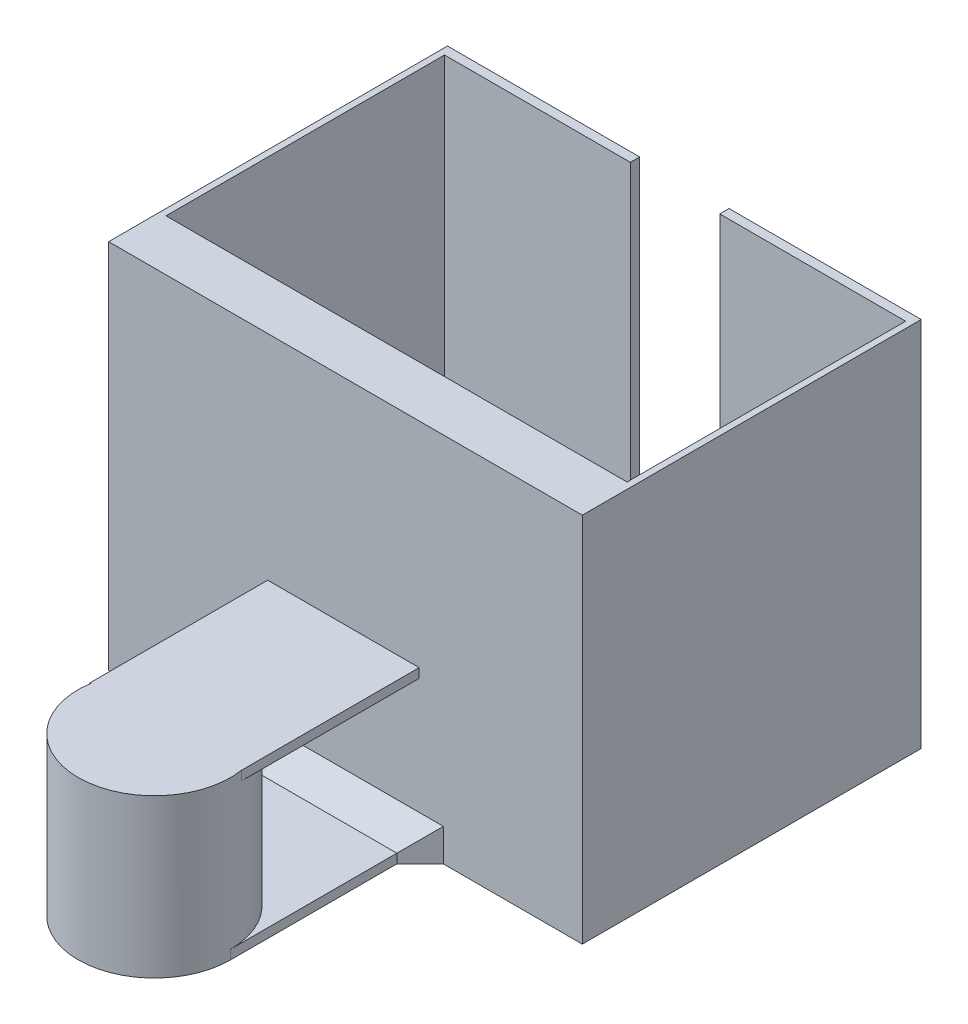
ISO-10303-21;
HEADER;
FILE_DESCRIPTION(('STEP AP214'),'2;1');
FILE_NAME('part.step','',(''),(''),'','','');
FILE_SCHEMA(('AUTOMOTIVE_DESIGN { 1 0 10303 214 1 1 1 1 }'));
ENDSEC;
DATA;
#1=APPLICATION_CONTEXT('core data for automotive mechanical design processes');
#2=APPLICATION_PROTOCOL_DEFINITION('international standard','automotive_design',2000,#1);
#3=PRODUCT_CONTEXT('',#1,'mechanical');
#4=PRODUCT('Part','Part','',(#3));
#5=PRODUCT_RELATED_PRODUCT_CATEGORY('part','',(#4));
#6=PRODUCT_DEFINITION_FORMATION('','',#4);
#7=PRODUCT_DEFINITION_CONTEXT('part definition',#1,'design');
#8=PRODUCT_DEFINITION('design','',#6,#7);
#9=PRODUCT_DEFINITION_SHAPE('','',#8);
#10=(LENGTH_UNIT() NAMED_UNIT(*) SI_UNIT(.MILLI.,.METRE.));
#11=(NAMED_UNIT(*) PLANE_ANGLE_UNIT() SI_UNIT($,.RADIAN.));
#12=(NAMED_UNIT(*) SI_UNIT($,.STERADIAN.) SOLID_ANGLE_UNIT());
#13=UNCERTAINTY_MEASURE_WITH_UNIT(LENGTH_MEASURE(1.E-05),#10,'distance_accuracy_value','');
#14=(GEOMETRIC_REPRESENTATION_CONTEXT(3) GLOBAL_UNCERTAINTY_ASSIGNED_CONTEXT((#13)) GLOBAL_UNIT_ASSIGNED_CONTEXT((#10,
#11,#12)) REPRESENTATION_CONTEXT('',''));
#15=CARTESIAN_POINT('',(0.,0.,0.));
#16=DIRECTION('',(0.,0.,1.));
#17=DIRECTION('',(1.,0.,0.));
#18=AXIS2_PLACEMENT_3D('',#15,#16,#17);
#19=CARTESIAN_POINT('',(40.4228170122298,50.8,-60.8869664013859));
#20=DIRECTION('',(0.,0.,-1.));
#21=DIRECTION('',(-1.,0.,0.));
#22=AXIS2_PLACEMENT_3D('',#19,#20,#21);
#23=PLANE('',#22);
#24=DIRECTION('',(1.,0.,0.));
#25=VECTOR('',#24,1.);
#26=CARTESIAN_POINT('',(83.0107805210788,4.44499999999998,-60.8869664013859));
#27=LINE('',#26,#25);
#28=CARTESIAN_POINT('',(59.0031335033808,4.44499999999998,-60.8869664013859));
#29=VERTEX_POINT('',#28);
#30=CARTESIAN_POINT('',(86.1857805210788,4.44499999999998,-60.8869664013859));
#31=VERTEX_POINT('',#30);
#32=EDGE_CURVE('E432',#29,#31,#27,.T.);
#33=ORIENTED_EDGE('',*,*,#32,.T.);
#34=DIRECTION('',(0.,-1.,0.));
#35=VECTOR('',#34,1.);
#36=CARTESIAN_POINT('',(86.1857805210788,0.,-60.8869664013859));
#37=LINE('',#36,#35);
#38=CARTESIAN_POINT('',(86.1857805210788,0.,-60.8869664013859));
#39=VERTEX_POINT('',#38);
#40=EDGE_CURVE('E435',#31,#39,#37,.T.);
#41=ORIENTED_EDGE('',*,*,#40,.T.);
#42=DIRECTION('',(1.,0.,0.));
#43=VECTOR('',#42,1.);
#44=CARTESIAN_POINT('',(40.4228170122298,0.,-60.8869664013859));
#45=LINE('',#44,#43);
#46=CARTESIAN_POINT('',(105.19281701223,0.,-60.8869664013859));
#47=VERTEX_POINT('',#46);
#48=EDGE_CURVE('E342',#39,#47,#45,.T.);
#49=ORIENTED_EDGE('',*,*,#48,.T.);
#50=DIRECTION('',(0.,-1.,0.));
#51=VECTOR('',#50,1.);
#52=CARTESIAN_POINT('',(105.19281701223,50.8,-60.8869664013859));
#53=LINE('',#52,#51);
#54=CARTESIAN_POINT('',(105.19281701223,50.8,-60.8869664013859));
#55=VERTEX_POINT('',#54);
#56=EDGE_CURVE('E415',#55,#47,#53,.T.);
#57=ORIENTED_EDGE('',*,*,#56,.F.);
#58=DIRECTION('',(1.,0.,0.));
#59=VECTOR('',#58,1.);
#60=CARTESIAN_POINT('',(40.4228170122298,50.8,-60.8869664013859));
#61=LINE('',#60,#59);
#62=CARTESIAN_POINT('',(40.4228170122298,50.8,-60.8869664013859));
#63=VERTEX_POINT('',#62);
#64=EDGE_CURVE('E304',#63,#55,#61,.T.);
#65=ORIENTED_EDGE('',*,*,#64,.F.);
#66=DIRECTION('',(0.,-1.,0.));
#67=VECTOR('',#66,1.);
#68=CARTESIAN_POINT('',(40.4228170122298,50.8,-60.8869664013859));
#69=LINE('',#68,#67);
#70=CARTESIAN_POINT('',(40.4228170122298,0.,-60.8869664013859));
#71=VERTEX_POINT('',#70);
#72=EDGE_CURVE('E419',#63,#71,#69,.T.);
#73=ORIENTED_EDGE('',*,*,#72,.T.);
#74=CARTESIAN_POINT('',(59.0031335033808,0.,-60.8869664013859));
#75=VERTEX_POINT('',#74);
#76=EDGE_CURVE('E343',#71,#75,#45,.T.);
#77=ORIENTED_EDGE('',*,*,#76,.T.);
#78=DIRECTION('',(0.,1.,0.));
#79=VECTOR('',#78,1.);
#80=CARTESIAN_POINT('',(59.0031335033808,1.27,-60.8869664013859));
#81=LINE('',#80,#79);
#82=EDGE_CURVE('E429',#75,#29,#81,.T.);
#83=ORIENTED_EDGE('',*,*,#82,.T.);
#84=EDGE_LOOP('',(#33,#41,#49,#57,#65,#73,#77,#83));
#85=FACE_BOUND('',#84,.T.);
#86=DIRECTION('',(-1.,0.,0.));
#87=VECTOR('',#86,1.);
#88=CARTESIAN_POINT('',(62.1781335033808,20.32,-60.8869664013859));
#89=LINE('',#88,#87);
#90=CARTESIAN_POINT('',(82.8854084274792,20.32,-60.8869664013859));
#91=VERTEX_POINT('',#90);
#92=CARTESIAN_POINT('',(62.1781335033808,20.32,-60.8869664013859));
#93=VERTEX_POINT('',#92);
#94=EDGE_CURVE('E220',#91,#93,#89,.T.);
#95=ORIENTED_EDGE('',*,*,#94,.T.);
#96=DIRECTION('',(0.,1.,0.));
#97=VECTOR('',#96,1.);
#98=CARTESIAN_POINT('',(62.1781335033808,20.32,-60.8869664013859));
#99=LINE('',#98,#97);
#100=CARTESIAN_POINT('',(62.1781335033808,21.59,-60.8869664013859));
#101=VERTEX_POINT('',#100);
#102=EDGE_CURVE('E236',#93,#101,#99,.T.);
#103=ORIENTED_EDGE('',*,*,#102,.T.);
#104=DIRECTION('',(-1.,0.,0.));
#105=VECTOR('',#104,1.);
#106=CARTESIAN_POINT('',(62.1781335033808,21.59,-60.8869664013859));
#107=LINE('',#106,#105);
#108=CARTESIAN_POINT('',(82.8854084274792,21.59,-60.8869664013859));
#109=VERTEX_POINT('',#108);
#110=EDGE_CURVE('E238',#109,#101,#107,.T.);
#111=ORIENTED_EDGE('',*,*,#110,.F.);
#112=DIRECTION('',(0.,1.,0.));
#113=VECTOR('',#112,1.);
#114=CARTESIAN_POINT('',(82.8854084274792,20.32,-60.8869664013859));
#115=LINE('',#114,#113);
#116=EDGE_CURVE('E259',#91,#109,#115,.T.);
#117=ORIENTED_EDGE('',*,*,#116,.F.);
#118=EDGE_LOOP('',(#95,#103,#111,#117));
#119=FACE_BOUND('',#118,.T.);
#120=ADVANCED_FACE('F49',(#85,#119),#23,.F.);
#121=CARTESIAN_POINT('',(40.4228170122298,50.8,-60.8869664013859));
#122=DIRECTION('',(1.,0.,0.));
#123=DIRECTION('',(0.,0.,-1.));
#124=AXIS2_PLACEMENT_3D('',#121,#122,#123);
#125=PLANE('',#124);
#126=DIRECTION('',(0.,0.,1.));
#127=VECTOR('',#126,1.);
#128=CARTESIAN_POINT('',(40.4228170122298,0.,-60.8869664013859));
#129=LINE('',#128,#127);
#130=CARTESIAN_POINT('',(40.4228170122298,0.,-107.222916401386));
#131=VERTEX_POINT('',#130);
#132=EDGE_CURVE('E299',#131,#71,#129,.T.);
#133=ORIENTED_EDGE('',*,*,#132,.T.);
#134=ORIENTED_EDGE('',*,*,#72,.F.);
#135=DIRECTION('',(0.,0.,1.));
#136=VECTOR('',#135,1.);
#137=CARTESIAN_POINT('',(40.4228170122298,50.8,-60.8869664013859));
#138=LINE('',#137,#136);
#139=CARTESIAN_POINT('',(40.4228170122298,50.8,-107.222916401386));
#140=VERTEX_POINT('',#139);
#141=EDGE_CURVE('E300',#140,#63,#138,.T.);
#142=ORIENTED_EDGE('',*,*,#141,.F.);
#143=DIRECTION('',(0.,-1.,0.));
#144=VECTOR('',#143,1.);
#145=CARTESIAN_POINT('',(40.4228170122298,50.8,-107.222916401386));
#146=LINE('',#145,#144);
#147=EDGE_CURVE('E338',#140,#131,#146,.T.);
#148=ORIENTED_EDGE('',*,*,#147,.T.);
#149=EDGE_LOOP('',(#133,#134,#142,#148));
#150=FACE_BOUND('',#149,.T.);
#151=ADVANCED_FACE('F468',(#150),#125,.F.);
#152=CARTESIAN_POINT('',(105.19281701223,50.8,-60.8869664013859));
#153=DIRECTION('',(-1.,0.,0.));
#154=DIRECTION('',(0.,0.,1.));
#155=AXIS2_PLACEMENT_3D('',#152,#153,#154);
#156=PLANE('',#155);
#157=DIRECTION('',(0.,0.,-1.));
#158=VECTOR('',#157,1.);
#159=CARTESIAN_POINT('',(105.19281701223,0.,-60.8869664013859));
#160=LINE('',#159,#158);
#161=CARTESIAN_POINT('',(105.19281701223,0.,-107.222916401386));
#162=VERTEX_POINT('',#161);
#163=EDGE_CURVE('E347',#47,#162,#160,.T.);
#164=ORIENTED_EDGE('',*,*,#163,.T.);
#165=DIRECTION('',(0.,-1.,0.));
#166=VECTOR('',#165,1.);
#167=CARTESIAN_POINT('',(105.19281701223,50.8,-107.222916401386));
#168=LINE('',#167,#166);
#169=CARTESIAN_POINT('',(105.19281701223,50.8,-107.222916401386));
#170=VERTEX_POINT('',#169);
#171=EDGE_CURVE('E411',#170,#162,#168,.T.);
#172=ORIENTED_EDGE('',*,*,#171,.F.);
#173=DIRECTION('',(0.,0.,-1.));
#174=VECTOR('',#173,1.);
#175=CARTESIAN_POINT('',(105.19281701223,50.8,-60.8869664013859));
#176=LINE('',#175,#174);
#177=EDGE_CURVE('E308',#55,#170,#176,.T.);
#178=ORIENTED_EDGE('',*,*,#177,.F.);
#179=ORIENTED_EDGE('',*,*,#56,.T.);
#180=EDGE_LOOP('',(#164,#172,#178,#179));
#181=FACE_BOUND('',#180,.T.);
#182=ADVANCED_FACE('F519',(#181),#156,.F.);
#183=CARTESIAN_POINT('',(78.9190570122298,50.8,-107.222916401386));
#184=DIRECTION('',(0.,0.,1.));
#185=DIRECTION('',(1.,0.,0.));
#186=AXIS2_PLACEMENT_3D('',#183,#184,#185);
#187=PLANE('',#186);
#188=DIRECTION('',(-1.,0.,0.));
#189=VECTOR('',#188,1.);
#190=CARTESIAN_POINT('',(78.9190570122298,0.,-107.222916401386));
#191=LINE('',#190,#189);
#192=CARTESIAN_POINT('',(78.9190570122298,0.,-107.222916401386));
#193=VERTEX_POINT('',#192);
#194=EDGE_CURVE('E350',#162,#193,#191,.T.);
#195=ORIENTED_EDGE('',*,*,#194,.T.);
#196=DIRECTION('',(0.,-1.,0.));
#197=VECTOR('',#196,1.);
#198=CARTESIAN_POINT('',(78.9190570122298,50.8,-107.222916401386));
#199=LINE('',#198,#197);
#200=CARTESIAN_POINT('',(78.9190570122298,50.8,-107.222916401386));
#201=VERTEX_POINT('',#200);
#202=EDGE_CURVE('E407',#201,#193,#199,.T.);
#203=ORIENTED_EDGE('',*,*,#202,.F.);
#204=DIRECTION('',(-1.,0.,0.));
#205=VECTOR('',#204,1.);
#206=CARTESIAN_POINT('',(78.9190570122298,50.8,-107.222916401386));
#207=LINE('',#206,#205);
#208=EDGE_CURVE('E311',#170,#201,#207,.T.);
#209=ORIENTED_EDGE('',*,*,#208,.F.);
#210=ORIENTED_EDGE('',*,*,#171,.T.);
#211=EDGE_LOOP('',(#195,#203,#209,#210));
#212=FACE_BOUND('',#211,.T.);
#213=ADVANCED_FACE('F513',(#212),#187,.F.);
#214=CARTESIAN_POINT('',(78.9190570122298,50.8,-105.952916401386));
#215=DIRECTION('',(1.,0.,0.));
#216=DIRECTION('',(0.,0.,-1.));
#217=AXIS2_PLACEMENT_3D('',#214,#215,#216);
#218=PLANE('',#217);
#219=DIRECTION('',(0.,0.,1.));
#220=VECTOR('',#219,1.);
#221=CARTESIAN_POINT('',(78.9190570122298,0.,-105.952916401386));
#222=LINE('',#221,#220);
#223=CARTESIAN_POINT('',(78.9190570122298,0.,-105.952916401386));
#224=VERTEX_POINT('',#223);
#225=EDGE_CURVE('E353',#193,#224,#222,.T.);
#226=ORIENTED_EDGE('',*,*,#225,.T.);
#227=DIRECTION('',(0.,-1.,0.));
#228=VECTOR('',#227,1.);
#229=CARTESIAN_POINT('',(78.9190570122298,50.8,-105.952916401386));
#230=LINE('',#229,#228);
#231=CARTESIAN_POINT('',(78.9190570122298,50.8,-105.952916401386));
#232=VERTEX_POINT('',#231);
#233=EDGE_CURVE('E403',#232,#224,#230,.T.);
#234=ORIENTED_EDGE('',*,*,#233,.F.);
#235=DIRECTION('',(0.,0.,1.));
#236=VECTOR('',#235,1.);
#237=CARTESIAN_POINT('',(78.9190570122298,50.8,-105.952916401386));
#238=LINE('',#237,#236);
#239=EDGE_CURVE('E314',#201,#232,#238,.T.);
#240=ORIENTED_EDGE('',*,*,#239,.F.);
#241=ORIENTED_EDGE('',*,*,#202,.T.);
#242=EDGE_LOOP('',(#226,#234,#240,#241));
#243=FACE_BOUND('',#242,.T.);
#244=ADVANCED_FACE('F509',(#243),#218,.F.);
#245=CARTESIAN_POINT('',(104.32921701223,50.8,-105.952916401386));
#246=DIRECTION('',(0.,0.,-1.));
#247=DIRECTION('',(-1.,0.,0.));
#248=AXIS2_PLACEMENT_3D('',#245,#246,#247);
#249=PLANE('',#248);
#250=DIRECTION('',(1.,0.,0.));
#251=VECTOR('',#250,1.);
#252=CARTESIAN_POINT('',(104.32921701223,0.,-105.952916401386));
#253=LINE('',#252,#251);
#254=CARTESIAN_POINT('',(104.32921701223,0.,-105.952916401386));
#255=VERTEX_POINT('',#254);
#256=EDGE_CURVE('E356',#224,#255,#253,.T.);
#257=ORIENTED_EDGE('',*,*,#256,.T.);
#258=DIRECTION('',(0.,-1.,0.));
#259=VECTOR('',#258,1.);
#260=CARTESIAN_POINT('',(104.32921701223,50.8,-105.952916401386));
#261=LINE('',#260,#259);
#262=CARTESIAN_POINT('',(104.32921701223,50.8,-105.952916401386));
#263=VERTEX_POINT('',#262);
#264=EDGE_CURVE('E399',#263,#255,#261,.T.);
#265=ORIENTED_EDGE('',*,*,#264,.F.);
#266=DIRECTION('',(1.,0.,0.));
#267=VECTOR('',#266,1.);
#268=CARTESIAN_POINT('',(104.32921701223,50.8,-105.952916401386));
#269=LINE('',#268,#267);
#270=EDGE_CURVE('E317',#232,#263,#269,.T.);
#271=ORIENTED_EDGE('',*,*,#270,.F.);
#272=ORIENTED_EDGE('',*,*,#233,.T.);
#273=EDGE_LOOP('',(#257,#265,#271,#272));
#274=FACE_BOUND('',#273,.T.);
#275=ADVANCED_FACE('F504',(#274),#249,.F.);
#276=CARTESIAN_POINT('',(104.32921701223,50.8,-67.8719664013859));
#277=DIRECTION('',(1.,0.,0.));
#278=DIRECTION('',(0.,0.,-1.));
#279=AXIS2_PLACEMENT_3D('',#276,#277,#278);
#280=PLANE('',#279);
#281=DIRECTION('',(0.,0.,1.));
#282=VECTOR('',#281,1.);
#283=CARTESIAN_POINT('',(104.32921701223,0.,-67.8719664013859));
#284=LINE('',#283,#282);
#285=CARTESIAN_POINT('',(104.32921701223,0.,-67.8719664013859));
#286=VERTEX_POINT('',#285);
#287=EDGE_CURVE('E359',#255,#286,#284,.T.);
#288=ORIENTED_EDGE('',*,*,#287,.T.);
#289=DIRECTION('',(0.,-1.,0.));
#290=VECTOR('',#289,1.);
#291=CARTESIAN_POINT('',(104.32921701223,50.8,-67.8719664013859));
#292=LINE('',#291,#290);
#293=CARTESIAN_POINT('',(104.32921701223,50.8,-67.8719664013859));
#294=VERTEX_POINT('',#293);
#295=EDGE_CURVE('E395',#294,#286,#292,.T.);
#296=ORIENTED_EDGE('',*,*,#295,.F.);
#297=DIRECTION('',(0.,0.,1.));
#298=VECTOR('',#297,1.);
#299=CARTESIAN_POINT('',(104.32921701223,50.8,-67.8719664013859));
#300=LINE('',#299,#298);
#301=EDGE_CURVE('E320',#263,#294,#300,.T.);
#302=ORIENTED_EDGE('',*,*,#301,.F.);
#303=ORIENTED_EDGE('',*,*,#264,.T.);
#304=EDGE_LOOP('',(#288,#296,#302,#303));
#305=FACE_BOUND('',#304,.T.);
#306=ADVANCED_FACE('F498',(#305),#280,.F.);
#307=CARTESIAN_POINT('',(41.2864170122298,50.8,-67.8719664013859));
#308=DIRECTION('',(0.,0.,1.));
#309=DIRECTION('',(1.,0.,0.));
#310=AXIS2_PLACEMENT_3D('',#307,#308,#309);
#311=PLANE('',#310);
#312=DIRECTION('',(-1.,0.,0.));
#313=VECTOR('',#312,1.);
#314=CARTESIAN_POINT('',(41.2864170122298,0.,-67.8719664013859));
#315=LINE('',#314,#313);
#316=CARTESIAN_POINT('',(41.2864170122298,0.,-67.8719664013859));
#317=VERTEX_POINT('',#316);
#318=EDGE_CURVE('E362',#286,#317,#315,.T.);
#319=ORIENTED_EDGE('',*,*,#318,.T.);
#320=DIRECTION('',(0.,-1.,0.));
#321=VECTOR('',#320,1.);
#322=CARTESIAN_POINT('',(41.2864170122298,50.8,-67.8719664013859));
#323=LINE('',#322,#321);
#324=CARTESIAN_POINT('',(41.2864170122298,50.8,-67.8719664013859));
#325=VERTEX_POINT('',#324);
#326=EDGE_CURVE('E391',#325,#317,#323,.T.);
#327=ORIENTED_EDGE('',*,*,#326,.F.);
#328=DIRECTION('',(-1.,0.,0.));
#329=VECTOR('',#328,1.);
#330=CARTESIAN_POINT('',(41.2864170122298,50.8,-67.8719664013859));
#331=LINE('',#330,#329);
#332=EDGE_CURVE('E323',#294,#325,#331,.T.);
#333=ORIENTED_EDGE('',*,*,#332,.F.);
#334=ORIENTED_EDGE('',*,*,#295,.T.);
#335=EDGE_LOOP('',(#319,#327,#333,#334));
#336=FACE_BOUND('',#335,.T.);
#337=ADVANCED_FACE('F494',(#336),#311,.F.);
#338=CARTESIAN_POINT('',(41.2864170122298,50.8,-105.952916401386));
#339=DIRECTION('',(-1.,0.,0.));
#340=DIRECTION('',(0.,0.,1.));
#341=AXIS2_PLACEMENT_3D('',#338,#339,#340);
#342=PLANE('',#341);
#343=DIRECTION('',(0.,0.,-1.));
#344=VECTOR('',#343,1.);
#345=CARTESIAN_POINT('',(41.2864170122298,0.,-105.952916401386));
#346=LINE('',#345,#344);
#347=CARTESIAN_POINT('',(41.2864170122298,0.,-105.952916401386));
#348=VERTEX_POINT('',#347);
#349=EDGE_CURVE('E365',#317,#348,#346,.T.);
#350=ORIENTED_EDGE('',*,*,#349,.T.);
#351=DIRECTION('',(0.,-1.,0.));
#352=VECTOR('',#351,1.);
#353=CARTESIAN_POINT('',(41.2864170122298,50.8,-105.952916401386));
#354=LINE('',#353,#352);
#355=CARTESIAN_POINT('',(41.2864170122298,50.8,-105.952916401386));
#356=VERTEX_POINT('',#355);
#357=EDGE_CURVE('E387',#356,#348,#354,.T.);
#358=ORIENTED_EDGE('',*,*,#357,.F.);
#359=DIRECTION('',(0.,0.,-1.));
#360=VECTOR('',#359,1.);
#361=CARTESIAN_POINT('',(41.2864170122298,50.8,-105.952916401386));
#362=LINE('',#361,#360);
#363=EDGE_CURVE('E326',#325,#356,#362,.T.);
#364=ORIENTED_EDGE('',*,*,#363,.F.);
#365=ORIENTED_EDGE('',*,*,#326,.T.);
#366=EDGE_LOOP('',(#350,#358,#364,#365));
#367=FACE_BOUND('',#366,.T.);
#368=ADVANCED_FACE('F489',(#367),#342,.F.);
#369=CARTESIAN_POINT('',(66.6965770122298,50.8,-105.952916401386));
#370=DIRECTION('',(0.,0.,-1.));
#371=DIRECTION('',(-1.,0.,0.));
#372=AXIS2_PLACEMENT_3D('',#369,#370,#371);
#373=PLANE('',#372);
#374=DIRECTION('',(1.,0.,0.));
#375=VECTOR('',#374,1.);
#376=CARTESIAN_POINT('',(66.6965770122298,0.,-105.952916401386));
#377=LINE('',#376,#375);
#378=CARTESIAN_POINT('',(66.6965770122298,0.,-105.952916401386));
#379=VERTEX_POINT('',#378);
#380=EDGE_CURVE('E368',#348,#379,#377,.T.);
#381=ORIENTED_EDGE('',*,*,#380,.T.);
#382=DIRECTION('',(0.,-1.,0.));
#383=VECTOR('',#382,1.);
#384=CARTESIAN_POINT('',(66.6965770122298,50.8,-105.952916401386));
#385=LINE('',#384,#383);
#386=CARTESIAN_POINT('',(66.6965770122298,50.8,-105.952916401386));
#387=VERTEX_POINT('',#386);
#388=EDGE_CURVE('E383',#387,#379,#385,.T.);
#389=ORIENTED_EDGE('',*,*,#388,.F.);
#390=DIRECTION('',(1.,0.,0.));
#391=VECTOR('',#390,1.);
#392=CARTESIAN_POINT('',(66.6965770122298,50.8,-105.952916401386));
#393=LINE('',#392,#391);
#394=EDGE_CURVE('E329',#356,#387,#393,.T.);
#395=ORIENTED_EDGE('',*,*,#394,.F.);
#396=ORIENTED_EDGE('',*,*,#357,.T.);
#397=EDGE_LOOP('',(#381,#389,#395,#396));
#398=FACE_BOUND('',#397,.T.);
#399=ADVANCED_FACE('F483',(#398),#373,.F.);
#400=CARTESIAN_POINT('',(66.6965770122298,50.8,-107.222916401386));
#401=DIRECTION('',(-1.,0.,0.));
#402=DIRECTION('',(0.,0.,1.));
#403=AXIS2_PLACEMENT_3D('',#400,#401,#402);
#404=PLANE('',#403);
#405=DIRECTION('',(0.,0.,-1.));
#406=VECTOR('',#405,1.);
#407=CARTESIAN_POINT('',(66.6965770122298,0.,-107.222916401386));
#408=LINE('',#407,#406);
#409=CARTESIAN_POINT('',(66.6965770122298,0.,-107.222916401386));
#410=VERTEX_POINT('',#409);
#411=EDGE_CURVE('E371',#379,#410,#408,.T.);
#412=ORIENTED_EDGE('',*,*,#411,.T.);
#413=DIRECTION('',(0.,-1.,0.));
#414=VECTOR('',#413,1.);
#415=CARTESIAN_POINT('',(66.6965770122298,50.8,-107.222916401386));
#416=LINE('',#415,#414);
#417=CARTESIAN_POINT('',(66.6965770122298,50.8,-107.222916401386));
#418=VERTEX_POINT('',#417);
#419=EDGE_CURVE('E379',#418,#410,#416,.T.);
#420=ORIENTED_EDGE('',*,*,#419,.F.);
#421=DIRECTION('',(0.,0.,-1.));
#422=VECTOR('',#421,1.);
#423=CARTESIAN_POINT('',(66.6965770122298,50.8,-107.222916401386));
#424=LINE('',#423,#422);
#425=EDGE_CURVE('E332',#387,#418,#424,.T.);
#426=ORIENTED_EDGE('',*,*,#425,.F.);
#427=ORIENTED_EDGE('',*,*,#388,.T.);
#428=EDGE_LOOP('',(#412,#420,#426,#427));
#429=FACE_BOUND('',#428,.T.);
#430=ADVANCED_FACE('F479',(#429),#404,.F.);
#431=CARTESIAN_POINT('',(40.4228170122298,50.8,-107.222916401386));
#432=DIRECTION('',(0.,0.,1.));
#433=DIRECTION('',(1.,0.,0.));
#434=AXIS2_PLACEMENT_3D('',#431,#432,#433);
#435=PLANE('',#434);
#436=DIRECTION('',(-1.,0.,0.));
#437=VECTOR('',#436,1.);
#438=CARTESIAN_POINT('',(40.4228170122298,0.,-107.222916401386));
#439=LINE('',#438,#437);
#440=EDGE_CURVE('E305',#410,#131,#439,.T.);
#441=ORIENTED_EDGE('',*,*,#440,.T.);
#442=ORIENTED_EDGE('',*,*,#147,.F.);
#443=DIRECTION('',(-1.,0.,0.));
#444=VECTOR('',#443,1.);
#445=CARTESIAN_POINT('',(40.4228170122298,50.8,-107.222916401386));
#446=LINE('',#445,#444);
#447=EDGE_CURVE('E335',#418,#140,#446,.T.);
#448=ORIENTED_EDGE('',*,*,#447,.F.);
#449=ORIENTED_EDGE('',*,*,#419,.T.);
#450=EDGE_LOOP('',(#441,#442,#448,#449));
#451=FACE_BOUND('',#450,.T.);
#452=ADVANCED_FACE('F474',(#451),#435,.F.);
#453=CARTESIAN_POINT('',(0.,50.8,0.));
#454=DIRECTION('',(0.,-1.,0.));
#455=DIRECTION('',(0.,0.,-1.));
#456=AXIS2_PLACEMENT_3D('',#453,#454,#455);
#457=PLANE('',#456);
#458=ORIENTED_EDGE('',*,*,#141,.T.);
#459=ORIENTED_EDGE('',*,*,#64,.T.);
#460=ORIENTED_EDGE('',*,*,#177,.T.);
#461=ORIENTED_EDGE('',*,*,#208,.T.);
#462=ORIENTED_EDGE('',*,*,#239,.T.);
#463=ORIENTED_EDGE('',*,*,#270,.T.);
#464=ORIENTED_EDGE('',*,*,#301,.T.);
#465=ORIENTED_EDGE('',*,*,#332,.T.);
#466=ORIENTED_EDGE('',*,*,#363,.T.);
#467=ORIENTED_EDGE('',*,*,#394,.T.);
#468=ORIENTED_EDGE('',*,*,#425,.T.);
#469=ORIENTED_EDGE('',*,*,#447,.T.);
#470=EDGE_LOOP('',(#458,#459,#460,#461,#462,#463,#464,#465,#466,#467,#468,#469));
#471=FACE_BOUND('',#470,.T.);
#472=ADVANCED_FACE('F663',(#471),#457,.F.);
#473=CARTESIAN_POINT('',(0.,0.,0.));
#474=DIRECTION('',(0.,-1.,0.));
#475=DIRECTION('',(0.,0.,-1.));
#476=AXIS2_PLACEMENT_3D('',#473,#474,#475);
#477=PLANE('',#476);
#478=DIRECTION('',(0.,0.,-1.));
#479=VECTOR('',#478,1.);
#480=CARTESIAN_POINT('',(83.0107805210788,0.,-34.9789664013859));
#481=LINE('',#480,#479);
#482=CARTESIAN_POINT('',(83.0107805210788,0.,-34.9789664013859));
#483=VERTEX_POINT('',#482);
#484=CARTESIAN_POINT('',(83.0107805210788,0.,-57.7119664013859));
#485=VERTEX_POINT('',#484);
#486=EDGE_CURVE('E292',#483,#485,#481,.T.);
#487=ORIENTED_EDGE('',*,*,#486,.F.);
#488=CARTESIAN_POINT('',(72.5944570122298,0.,-34.9789664013859));
#489=DIRECTION('',(0.,-1.,0.));
#490=DIRECTION('',(0.,0.,-1.));
#491=AXIS2_PLACEMENT_3D('',#488,#489,#490);
#492=CIRCLE('',#491,10.416323508849);
#493=CARTESIAN_POINT('',(62.1781335033808,0.,-34.9789664013859));
#494=VERTEX_POINT('',#493);
#495=EDGE_CURVE('E268',#483,#494,#492,.T.);
#496=ORIENTED_EDGE('',*,*,#495,.T.);
#497=DIRECTION('',(0.,0.,-1.));
#498=VECTOR('',#497,1.);
#499=CARTESIAN_POINT('',(62.1781335033808,0.,-34.9789664013859));
#500=LINE('',#499,#498);
#501=CARTESIAN_POINT('',(62.1781335033808,0.,-57.7119664013859));
#502=VERTEX_POINT('',#501);
#503=EDGE_CURVE('E296',#494,#502,#500,.T.);
#504=ORIENTED_EDGE('',*,*,#503,.T.);
#505=DIRECTION('',(0.707106781186543,0.,0.707106781186552));
#506=VECTOR('',#505,1.);
#507=CARTESIAN_POINT('',(62.1781335033808,0.,-57.7119664013859));
#508=LINE('',#507,#506);
#509=EDGE_CURVE('E11',#502,#75,#508,.F.);
#510=ORIENTED_EDGE('',*,*,#509,.T.);
#511=ORIENTED_EDGE('',*,*,#76,.F.);
#512=ORIENTED_EDGE('',*,*,#132,.F.);
#513=ORIENTED_EDGE('',*,*,#440,.F.);
#514=ORIENTED_EDGE('',*,*,#411,.F.);
#515=ORIENTED_EDGE('',*,*,#380,.F.);
#516=ORIENTED_EDGE('',*,*,#349,.F.);
#517=ORIENTED_EDGE('',*,*,#318,.F.);
#518=ORIENTED_EDGE('',*,*,#287,.F.);
#519=ORIENTED_EDGE('',*,*,#256,.F.);
#520=ORIENTED_EDGE('',*,*,#225,.F.);
#521=ORIENTED_EDGE('',*,*,#194,.F.);
#522=ORIENTED_EDGE('',*,*,#163,.F.);
#523=ORIENTED_EDGE('',*,*,#48,.F.);
#524=DIRECTION('',(0.707106781186543,0.,-0.707106781186552));
#525=VECTOR('',#524,1.);
#526=CARTESIAN_POINT('',(83.0107805210788,0.,-57.7119664013859));
#527=LINE('',#526,#525);
#528=EDGE_CURVE('E60',#39,#485,#527,.F.);
#529=ORIENTED_EDGE('',*,*,#528,.T.);
#530=EDGE_LOOP('',(#487,#496,#504,#510,#511,#512,#513,#514,#515,#516,#517,#518,#519,#520,#521,
#522,#523,#529));
#531=FACE_BOUND('',#530,.T.);
#532=ADVANCED_FACE('F460',(#531),#477,.T.);
#533=CARTESIAN_POINT('',(62.1781335033808,0.,-34.9789664013859));
#534=DIRECTION('',(1.,0.,0.));
#535=DIRECTION('',(0.,0.,-1.));
#536=AXIS2_PLACEMENT_3D('',#533,#534,#535);
#537=PLANE('',#536);
#538=DIRECTION('',(0.,0.,-1.));
#539=VECTOR('',#538,1.);
#540=CARTESIAN_POINT('',(62.1781335033808,1.27,-34.9789664013859));
#541=LINE('',#540,#539);
#542=CARTESIAN_POINT('',(62.1781335033808,1.27,-34.9789664013859));
#543=VERTEX_POINT('',#542);
#544=CARTESIAN_POINT('',(62.1781335033808,1.27,-57.7119664013859));
#545=VERTEX_POINT('',#544);
#546=EDGE_CURVE('E286',#543,#545,#541,.T.);
#547=ORIENTED_EDGE('',*,*,#546,.T.);
#548=DIRECTION('',(0.,-1.,0.));
#549=VECTOR('',#548,1.);
#550=CARTESIAN_POINT('',(62.1781335033808,0.,-57.7119664013859));
#551=LINE('',#550,#549);
#552=EDGE_CURVE('E68',#545,#502,#551,.T.);
#553=ORIENTED_EDGE('',*,*,#552,.T.);
#554=ORIENTED_EDGE('',*,*,#503,.F.);
#555=DIRECTION('',(0.,-1.,0.));
#556=VECTOR('',#555,1.);
#557=CARTESIAN_POINT('',(62.1781335033808,0.,-34.9789664013859));
#558=LINE('',#557,#556);
#559=EDGE_CURVE('E278',#543,#494,#558,.T.);
#560=ORIENTED_EDGE('',*,*,#559,.F.);
#561=EDGE_LOOP('',(#547,#553,#554,#560));
#562=FACE_BOUND('',#561,.T.);
#563=ADVANCED_FACE('F531',(#562),#537,.F.);
#564=CARTESIAN_POINT('',(83.0107805210788,0.,-34.9789664013859));
#565=DIRECTION('',(-1.,0.,0.));
#566=DIRECTION('',(0.,0.,1.));
#567=AXIS2_PLACEMENT_3D('',#564,#565,#566);
#568=PLANE('',#567);
#569=ORIENTED_EDGE('',*,*,#486,.T.);
#570=DIRECTION('',(0.,1.,0.));
#571=VECTOR('',#570,1.);
#572=CARTESIAN_POINT('',(83.0107805210788,1.27,-57.7119664013859));
#573=LINE('',#572,#571);
#574=CARTESIAN_POINT('',(83.0107805210788,1.27,-57.7119664013859));
#575=VERTEX_POINT('',#574);
#576=EDGE_CURVE('E425',#485,#575,#573,.T.);
#577=ORIENTED_EDGE('',*,*,#576,.T.);
#578=DIRECTION('',(0.,0.,-1.));
#579=VECTOR('',#578,1.);
#580=CARTESIAN_POINT('',(83.0107805210788,1.27,-34.9789664013859));
#581=LINE('',#580,#579);
#582=CARTESIAN_POINT('',(83.0107805210788,1.27,-34.9789664013859));
#583=VERTEX_POINT('',#582);
#584=EDGE_CURVE('E289',#583,#575,#581,.T.);
#585=ORIENTED_EDGE('',*,*,#584,.F.);
#586=DIRECTION('',(0.,1.,0.));
#587=VECTOR('',#586,1.);
#588=CARTESIAN_POINT('',(83.0107805210788,0.,-34.9789664013859));
#589=LINE('',#588,#587);
#590=EDGE_CURVE('E282',#483,#583,#589,.T.);
#591=ORIENTED_EDGE('',*,*,#590,.F.);
#592=EDGE_LOOP('',(#569,#577,#585,#591));
#593=FACE_BOUND('',#592,.T.);
#594=ADVANCED_FACE('F525',(#593),#568,.F.);
#595=CARTESIAN_POINT('',(62.1781335033808,1.27,-34.9789664013859));
#596=DIRECTION('',(0.,-1.,0.));
#597=DIRECTION('',(0.,0.,-1.));
#598=AXIS2_PLACEMENT_3D('',#595,#596,#597);
#599=PLANE('',#598);
#600=ORIENTED_EDGE('',*,*,#584,.T.);
#601=DIRECTION('',(-1.,0.,0.));
#602=VECTOR('',#601,1.);
#603=CARTESIAN_POINT('',(62.1781335033808,1.27,-57.7119664013859));
#604=LINE('',#603,#602);
#605=EDGE_CURVE('E76',#575,#545,#604,.T.);
#606=ORIENTED_EDGE('',*,*,#605,.T.);
#607=ORIENTED_EDGE('',*,*,#546,.F.);
#608=CARTESIAN_POINT('',(72.5944570122298,1.27,-34.9789664013859));
#609=DIRECTION('',(0.,-1.,0.));
#610=DIRECTION('',(0.,0.,-1.));
#611=AXIS2_PLACEMENT_3D('',#608,#609,#610);
#612=CIRCLE('',#611,10.416323508849);
#613=EDGE_CURVE('E272',#543,#583,#612,.T.);
#614=ORIENTED_EDGE('',*,*,#613,.T.);
#615=EDGE_LOOP('',(#600,#606,#607,#614));
#616=FACE_BOUND('',#615,.T.);
#617=ADVANCED_FACE('F532',(#616),#599,.F.);
#618=CARTESIAN_POINT('',(72.5944570122298,21.59,-34.9789664013859));
#619=DIRECTION('',(0.,-1.,0.));
#620=DIRECTION('',(0.,0.,-1.));
#621=AXIS2_PLACEMENT_3D('',#618,#619,#620);
#622=CYLINDRICAL_SURFACE('',#621,10.416323508849);
#623=DIRECTION('',(0.,-1.,0.));
#624=VECTOR('',#623,1.);
#625=CARTESIAN_POINT('',(62.3035055969805,21.59,-36.5902126302342));
#626=LINE('',#625,#624);
#627=CARTESIAN_POINT('',(62.3035055969805,20.32,-36.5902126302342));
#628=VERTEX_POINT('',#627);
#629=CARTESIAN_POINT('',(62.3035055969805,21.59,-36.5902126302342));
#630=VERTEX_POINT('',#629);
#631=EDGE_CURVE('E258',#628,#630,#626,.F.);
#632=ORIENTED_EDGE('',*,*,#631,.F.);
#633=CARTESIAN_POINT('',(72.5944570122298,20.32,-34.9789664013859));
#634=DIRECTION('',(0.,1.,0.));
#635=DIRECTION('',(0.,0.,1.));
#636=AXIS2_PLACEMENT_3D('',#633,#634,#635);
#637=CIRCLE('',#636,10.416323508849);
#638=CARTESIAN_POINT('',(82.8854084274792,20.32,-36.5902126302342));
#639=VERTEX_POINT('',#638);
#640=EDGE_CURVE('E230',#628,#639,#637,.F.);
#641=ORIENTED_EDGE('',*,*,#640,.T.);
#642=DIRECTION('',(0.,1.,0.));
#643=VECTOR('',#642,1.);
#644=CARTESIAN_POINT('',(82.8854084274792,20.32,-36.5902126302342));
#645=LINE('',#644,#643);
#646=CARTESIAN_POINT('',(82.8854084274792,21.59,-36.5902126302342));
#647=VERTEX_POINT('',#646);
#648=EDGE_CURVE('E219',#639,#647,#645,.T.);
#649=ORIENTED_EDGE('',*,*,#648,.T.);
#650=CARTESIAN_POINT('',(72.5944570122298,21.59,-34.9789664013859));
#651=DIRECTION('',(0.,-1.,0.));
#652=DIRECTION('',(0.,0.,-1.));
#653=AXIS2_PLACEMENT_3D('',#650,#651,#652);
#654=CIRCLE('',#653,10.416323508849);
#655=EDGE_CURVE('E269',#647,#630,#654,.T.);
#656=ORIENTED_EDGE('',*,*,#655,.T.);
#657=EDGE_LOOP('',(#632,#641,#649,#656));
#658=FACE_BOUND('',#657,.T.);
#659=ORIENTED_EDGE('',*,*,#590,.T.);
#660=ORIENTED_EDGE('',*,*,#613,.F.);
#661=ORIENTED_EDGE('',*,*,#559,.T.);
#662=ORIENTED_EDGE('',*,*,#495,.F.);
#663=EDGE_LOOP('',(#659,#660,#661,#662));
#664=FACE_BOUND('',#663,.T.);
#665=ADVANCED_FACE('F529',(#658,#664),#622,.T.);
#666=CARTESIAN_POINT('',(72.5944570122298,21.59,-34.9789664013859));
#667=DIRECTION('',(0.,-1.,0.));
#668=DIRECTION('',(0.,0.,-1.));
#669=AXIS2_PLACEMENT_3D('',#666,#667,#668);
#670=PLANE('',#669);
#671=ORIENTED_EDGE('',*,*,#655,.F.);
#672=DIRECTION('',(0.,0.,-1.));
#673=VECTOR('',#672,1.);
#674=CARTESIAN_POINT('',(82.8854084274792,21.59,-60.8869664013859));
#675=LINE('',#674,#673);
#676=EDGE_CURVE('E242',#647,#109,#675,.T.);
#677=ORIENTED_EDGE('',*,*,#676,.T.);
#678=ORIENTED_EDGE('',*,*,#110,.T.);
#679=DIRECTION('',(0.,0.,1.));
#680=VECTOR('',#679,1.);
#681=CARTESIAN_POINT('',(62.1781335033808,21.59,-60.8869664013859));
#682=LINE('',#681,#680);
#683=CARTESIAN_POINT('',(62.1781335033808,21.59,-36.5902126302342));
#684=VERTEX_POINT('',#683);
#685=EDGE_CURVE('E249',#101,#684,#682,.T.);
#686=ORIENTED_EDGE('',*,*,#685,.T.);
#687=DIRECTION('',(1.,0.,0.));
#688=VECTOR('',#687,1.);
#689=CARTESIAN_POINT('',(62.1781335033808,21.59,-36.5902126302342));
#690=LINE('',#689,#688);
#691=EDGE_CURVE('E214',#684,#630,#690,.T.);
#692=ORIENTED_EDGE('',*,*,#691,.T.);
#693=EDGE_LOOP('',(#671,#677,#678,#686,#692));
#694=FACE_BOUND('',#693,.T.);
#695=ADVANCED_FACE('F540',(#694),#670,.F.);
#696=CARTESIAN_POINT('',(62.1781335033808,20.32,-60.8869664013859));
#697=DIRECTION('',(-1.,0.,0.));
#698=DIRECTION('',(0.,0.,1.));
#699=AXIS2_PLACEMENT_3D('',#696,#697,#698);
#700=PLANE('',#699);
#701=ORIENTED_EDGE('',*,*,#685,.F.);
#702=ORIENTED_EDGE('',*,*,#102,.F.);
#703=DIRECTION('',(0.,0.,1.));
#704=VECTOR('',#703,1.);
#705=CARTESIAN_POINT('',(62.1781335033808,20.32,-60.8869664013859));
#706=LINE('',#705,#704);
#707=CARTESIAN_POINT('',(62.1781335033808,20.32,-36.5902126302342));
#708=VERTEX_POINT('',#707);
#709=EDGE_CURVE('E227',#93,#708,#706,.T.);
#710=ORIENTED_EDGE('',*,*,#709,.T.);
#711=DIRECTION('',(0.,1.,0.));
#712=VECTOR('',#711,1.);
#713=CARTESIAN_POINT('',(62.1781335033808,20.32,-36.5902126302342));
#714=LINE('',#713,#712);
#715=EDGE_CURVE('E208',#708,#684,#714,.T.);
#716=ORIENTED_EDGE('',*,*,#715,.T.);
#717=EDGE_LOOP('',(#701,#702,#710,#716));
#718=FACE_BOUND('',#717,.T.);
#719=ADVANCED_FACE('F234',(#718),#700,.T.);
#720=CARTESIAN_POINT('',(82.8854084274792,20.32,-60.8869664013859));
#721=DIRECTION('',(1.,0.,0.));
#722=DIRECTION('',(0.,0.,-1.));
#723=AXIS2_PLACEMENT_3D('',#720,#721,#722);
#724=PLANE('',#723);
#725=ORIENTED_EDGE('',*,*,#676,.F.);
#726=ORIENTED_EDGE('',*,*,#648,.F.);
#727=DIRECTION('',(0.,0.,-1.));
#728=VECTOR('',#727,1.);
#729=CARTESIAN_POINT('',(82.8854084274792,20.32,-60.8869664013859));
#730=LINE('',#729,#728);
#731=EDGE_CURVE('E232',#639,#91,#730,.T.);
#732=ORIENTED_EDGE('',*,*,#731,.T.);
#733=ORIENTED_EDGE('',*,*,#116,.T.);
#734=EDGE_LOOP('',(#725,#726,#732,#733));
#735=FACE_BOUND('',#734,.T.);
#736=ADVANCED_FACE('F571',(#735),#724,.T.);
#737=CARTESIAN_POINT('',(62.1781335033808,20.32,-36.5902126302342));
#738=DIRECTION('',(0.,0.,1.));
#739=DIRECTION('',(1.,0.,0.));
#740=AXIS2_PLACEMENT_3D('',#737,#738,#739);
#741=PLANE('',#740);
#742=DIRECTION('',(1.,0.,0.));
#743=VECTOR('',#742,1.);
#744=CARTESIAN_POINT('',(62.1781335033808,20.32,-36.5902126302342));
#745=LINE('',#744,#743);
#746=EDGE_CURVE('E212',#708,#628,#745,.T.);
#747=ORIENTED_EDGE('',*,*,#746,.T.);
#748=ORIENTED_EDGE('',*,*,#631,.T.);
#749=ORIENTED_EDGE('',*,*,#691,.F.);
#750=ORIENTED_EDGE('',*,*,#715,.F.);
#751=EDGE_LOOP('',(#747,#748,#749,#750));
#752=FACE_BOUND('',#751,.T.);
#753=ADVANCED_FACE('F210',(#752),#741,.T.);
#754=CARTESIAN_POINT('',(0.,20.32,0.));
#755=DIRECTION('',(0.,1.,0.));
#756=DIRECTION('',(0.,0.,1.));
#757=AXIS2_PLACEMENT_3D('',#754,#755,#756);
#758=PLANE('',#757);
#759=ORIENTED_EDGE('',*,*,#640,.F.);
#760=ORIENTED_EDGE('',*,*,#746,.F.);
#761=ORIENTED_EDGE('',*,*,#709,.F.);
#762=ORIENTED_EDGE('',*,*,#94,.F.);
#763=ORIENTED_EDGE('',*,*,#731,.F.);
#764=EDGE_LOOP('',(#759,#760,#761,#762,#763));
#765=FACE_BOUND('',#764,.T.);
#766=ADVANCED_FACE('F225',(#765),#758,.F.);
#767=CARTESIAN_POINT('',(62.1781335033808,0.,-57.7119664013859));
#768=DIRECTION('',(-0.707106781186552,0.,0.707106781186543));
#769=DIRECTION('',(0.,1.,0.));
#770=AXIS2_PLACEMENT_3D('',#767,#768,#769);
#771=PLANE('',#770);
#772=ORIENTED_EDGE('',*,*,#509,.F.);
#773=ORIENTED_EDGE('',*,*,#552,.F.);
#774=DIRECTION('',(-0.577350269189623,0.577350269189623,-0.577350269189631));
#775=VECTOR('',#774,1.);
#776=CARTESIAN_POINT('',(62.6014668367141,0.84666666666667,-57.2886330680526));
#777=LINE('',#776,#775);
#778=EDGE_CURVE('E54',#29,#545,#777,.F.);
#779=ORIENTED_EDGE('',*,*,#778,.F.);
#780=ORIENTED_EDGE('',*,*,#82,.F.);
#781=EDGE_LOOP('',(#772,#773,#779,#780));
#782=FACE_BOUND('',#781,.T.);
#783=ADVANCED_FACE('F52',(#782),#771,.T.);
#784=CARTESIAN_POINT('',(62.1781335033808,1.27,-57.7119664013859));
#785=DIRECTION('',(0.,0.707106781186552,0.707106781186543));
#786=DIRECTION('',(1.,0.,0.));
#787=AXIS2_PLACEMENT_3D('',#784,#785,#786);
#788=PLANE('',#787);
#789=ORIENTED_EDGE('',*,*,#778,.T.);
#790=ORIENTED_EDGE('',*,*,#605,.F.);
#791=DIRECTION('',(0.577350269189623,0.577350269189623,-0.577350269189631));
#792=VECTOR('',#791,1.);
#793=CARTESIAN_POINT('',(76.0665648485129,-5.67421567256595,-50.7677507288199));
#794=LINE('',#793,#792);
#795=EDGE_CURVE('E443',#31,#575,#794,.F.);
#796=ORIENTED_EDGE('',*,*,#795,.F.);
#797=ORIENTED_EDGE('',*,*,#32,.F.);
#798=EDGE_LOOP('',(#789,#790,#796,#797));
#799=FACE_BOUND('',#798,.T.);
#800=ADVANCED_FACE('F454',(#799),#788,.T.);
#801=CARTESIAN_POINT('',(83.0107805210788,0.,-57.7119664013859));
#802=DIRECTION('',(0.707106781186552,0.,0.707106781186543));
#803=DIRECTION('',(0.,-1.,0.));
#804=AXIS2_PLACEMENT_3D('',#801,#802,#803);
#805=PLANE('',#804);
#806=ORIENTED_EDGE('',*,*,#528,.F.);
#807=ORIENTED_EDGE('',*,*,#40,.F.);
#808=ORIENTED_EDGE('',*,*,#795,.T.);
#809=ORIENTED_EDGE('',*,*,#576,.F.);
#810=EDGE_LOOP('',(#806,#807,#808,#809));
#811=FACE_BOUND('',#810,.T.);
#812=ADVANCED_FACE('F522',(#811),#805,.T.);
#813=CLOSED_SHELL('',(#120,#151,#182,#213,#244,#275,#306,#337,#368,#399,#430,#452,#472,#532,
#563,#594,#617,#665,#695,#719,#736,#753,#766,#783,#800,#812));
#814=MANIFOLD_SOLID_BREP('B2',#813);
#815=ADVANCED_BREP_SHAPE_REPRESENTATION('',(#18,#814),#14);
#816=SHAPE_DEFINITION_REPRESENTATION(#9,#815);
ENDSEC;
END-ISO-10303-21;
